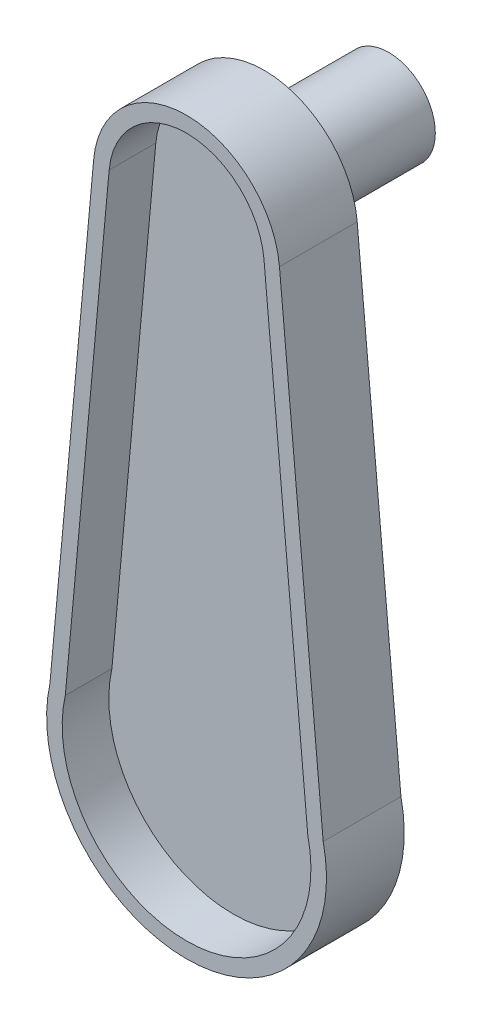
ISO-10303-21;
HEADER;
FILE_DESCRIPTION(('STEP AP214'),'2;1');
FILE_NAME('part.step','',(''),(''),'','','');
FILE_SCHEMA(('AUTOMOTIVE_DESIGN { 1 0 10303 214 1 1 1 1 }'));
ENDSEC;
DATA;
#1=APPLICATION_CONTEXT('core data for automotive mechanical design processes');
#2=APPLICATION_PROTOCOL_DEFINITION('international standard','automotive_design',2000,#1);
#3=PRODUCT_CONTEXT('',#1,'mechanical');
#4=PRODUCT('Part','Part','',(#3));
#5=PRODUCT_RELATED_PRODUCT_CATEGORY('part','',(#4));
#6=PRODUCT_DEFINITION_FORMATION('','',#4);
#7=PRODUCT_DEFINITION_CONTEXT('part definition',#1,'design');
#8=PRODUCT_DEFINITION('design','',#6,#7);
#9=PRODUCT_DEFINITION_SHAPE('','',#8);
#10=(LENGTH_UNIT() NAMED_UNIT(*) SI_UNIT(.MILLI.,.METRE.));
#11=(NAMED_UNIT(*) PLANE_ANGLE_UNIT() SI_UNIT($,.RADIAN.));
#12=(NAMED_UNIT(*) SI_UNIT($,.STERADIAN.) SOLID_ANGLE_UNIT());
#13=UNCERTAINTY_MEASURE_WITH_UNIT(LENGTH_MEASURE(1.E-05),#10,'distance_accuracy_value','');
#14=(GEOMETRIC_REPRESENTATION_CONTEXT(3) GLOBAL_UNCERTAINTY_ASSIGNED_CONTEXT((#13)) GLOBAL_UNIT_ASSIGNED_CONTEXT((#10,
#11,#12)) REPRESENTATION_CONTEXT('',''));
#15=CARTESIAN_POINT('',(0.,0.,0.));
#16=DIRECTION('',(0.,0.,1.));
#17=DIRECTION('',(1.,0.,0.));
#18=AXIS2_PLACEMENT_3D('',#15,#16,#17);
#19=CARTESIAN_POINT('',(0.,0.,1.));
#20=DIRECTION('',(0.,0.,1.));
#21=DIRECTION('',(1.,0.,0.));
#22=AXIS2_PLACEMENT_3D('',#19,#20,#21);
#23=PLANE('',#22);
#24=CARTESIAN_POINT('',(0.,0.,1.));
#25=DIRECTION('',(0.,0.,1.));
#26=DIRECTION('',(1.,0.,0.));
#27=AXIS2_PLACEMENT_3D('',#24,#25,#26);
#28=CIRCLE('',#27,4.);
#29=CARTESIAN_POINT('',(-3.9,0.88881944173156,1.));
#30=VERTEX_POINT('',#29);
#31=CARTESIAN_POINT('',(3.9,0.88881944173156,1.));
#32=VERTEX_POINT('',#31);
#33=EDGE_CURVE('E211',#30,#32,#28,.T.);
#34=ORIENTED_EDGE('',*,*,#33,.T.);
#35=DIRECTION('',(-0.0915624950186931,0.99579933194693,0.));
#36=VECTOR('',#35,1.);
#37=CARTESIAN_POINT('',(3.9,0.88881944173156,1.));
#38=LINE('',#37,#36);
#39=CARTESIAN_POINT('',(2.48949832986733,16.2289062375467,1.));
#40=VERTEX_POINT('',#39);
#41=EDGE_CURVE('E83',#32,#40,#38,.T.);
#42=ORIENTED_EDGE('',*,*,#41,.T.);
#43=CARTESIAN_POINT('',(0.,16.,1.));
#44=DIRECTION('',(0.,0.,-1.));
#45=DIRECTION('',(-1.,0.,0.));
#46=AXIS2_PLACEMENT_3D('',#43,#44,#45);
#47=CIRCLE('',#46,2.5);
#48=CARTESIAN_POINT('',(-2.48949832986733,16.2289062375467,1.));
#49=VERTEX_POINT('',#48);
#50=EDGE_CURVE('E216',#49,#40,#47,.T.);
#51=ORIENTED_EDGE('',*,*,#50,.F.);
#52=DIRECTION('',(0.0915624950186931,0.99579933194693,0.));
#53=VECTOR('',#52,1.);
#54=CARTESIAN_POINT('',(-3.9,0.88881944173156,1.));
#55=LINE('',#54,#53);
#56=EDGE_CURVE('E72',#30,#49,#55,.T.);
#57=ORIENTED_EDGE('',*,*,#56,.F.);
#58=EDGE_LOOP('',(#34,#42,#51,#57));
#59=FACE_BOUND('',#58,.T.);
#60=ADVANCED_FACE('F63',(#59),#23,.T.);
#61=CARTESIAN_POINT('',(0.,0.,2.5));
#62=DIRECTION('',(0.,0.,1.));
#63=DIRECTION('',(1.,0.,0.));
#64=AXIS2_PLACEMENT_3D('',#61,#62,#63);
#65=PLANE('',#64);
#66=CARTESIAN_POINT('',(0.,0.,2.5));
#67=DIRECTION('',(0.,0.,1.));
#68=DIRECTION('',(1.,0.,0.));
#69=AXIS2_PLACEMENT_3D('',#66,#67,#68);
#70=CIRCLE('',#69,4.5);
#71=CARTESIAN_POINT('',(-4.39495457775272,0.966630363422897,2.5));
#72=VERTEX_POINT('',#71);
#73=CARTESIAN_POINT('',(4.39495457775272,0.966630363422897,2.5));
#74=VERTEX_POINT('',#73);
#75=EDGE_CURVE('E170',#72,#74,#70,.T.);
#76=ORIENTED_EDGE('',*,*,#75,.T.);
#77=DIRECTION('',(-0.0915624950186931,0.99579933194693,0.));
#78=VECTOR('',#77,1.);
#79=CARTESIAN_POINT('',(4.39789966597346,0.934600689240907,2.5));
#80=LINE('',#79,#78);
#81=CARTESIAN_POINT('',(2.98739799584079,16.2746874850561,2.5));
#82=VERTEX_POINT('',#81);
#83=EDGE_CURVE('E174',#74,#82,#80,.T.);
#84=ORIENTED_EDGE('',*,*,#83,.T.);
#85=CARTESIAN_POINT('',(0.,16.,2.5));
#86=DIRECTION('',(0.,0.,1.));
#87=DIRECTION('',(1.,0.,0.));
#88=AXIS2_PLACEMENT_3D('',#85,#86,#87);
#89=CIRCLE('',#88,3.);
#90=CARTESIAN_POINT('',(-2.98739799584079,16.2746874850561,2.5));
#91=VERTEX_POINT('',#90);
#92=EDGE_CURVE('E178',#82,#91,#89,.T.);
#93=ORIENTED_EDGE('',*,*,#92,.T.);
#94=DIRECTION('',(-0.0915624950186931,-0.99579933194693,0.));
#95=VECTOR('',#94,1.);
#96=CARTESIAN_POINT('',(-4.39789966597346,0.934600689240907,2.5));
#97=LINE('',#96,#95);
#98=EDGE_CURVE('E181',#91,#72,#97,.T.);
#99=ORIENTED_EDGE('',*,*,#98,.T.);
#100=EDGE_LOOP('',(#76,#84,#93,#99));
#101=FACE_BOUND('',#100,.T.);
#102=DIRECTION('',(-0.0915624950186931,0.99579933194693,0.));
#103=VECTOR('',#102,1.);
#104=CARTESIAN_POINT('',(3.9,0.88881944173156,2.5));
#105=LINE('',#104,#103);
#106=CARTESIAN_POINT('',(3.9,0.88881944173156,2.5));
#107=VERTEX_POINT('',#106);
#108=CARTESIAN_POINT('',(2.48949832986733,16.2289062375467,2.5));
#109=VERTEX_POINT('',#108);
#110=EDGE_CURVE('E138',#107,#109,#105,.T.);
#111=ORIENTED_EDGE('',*,*,#110,.F.);
#112=CARTESIAN_POINT('',(0.,0.,2.5));
#113=DIRECTION('',(0.,0.,1.));
#114=DIRECTION('',(1.,0.,0.));
#115=AXIS2_PLACEMENT_3D('',#112,#113,#114);
#116=CIRCLE('',#115,4.);
#117=CARTESIAN_POINT('',(-3.9,0.88881944173156,2.5));
#118=VERTEX_POINT('',#117);
#119=EDGE_CURVE('E128',#118,#107,#116,.T.);
#120=ORIENTED_EDGE('',*,*,#119,.F.);
#121=DIRECTION('',(-0.0915624950186931,-0.99579933194693,0.));
#122=VECTOR('',#121,1.);
#123=CARTESIAN_POINT('',(-3.9,0.88881944173156,2.5));
#124=LINE('',#123,#122);
#125=CARTESIAN_POINT('',(-2.48949832986733,16.2289062375467,2.5));
#126=VERTEX_POINT('',#125);
#127=EDGE_CURVE('E156',#126,#118,#124,.T.);
#128=ORIENTED_EDGE('',*,*,#127,.F.);
#129=CARTESIAN_POINT('',(0.,16.,2.5));
#130=DIRECTION('',(0.,0.,1.));
#131=DIRECTION('',(-1.,0.,0.));
#132=AXIS2_PLACEMENT_3D('',#129,#130,#131);
#133=CIRCLE('',#132,2.5);
#134=EDGE_CURVE('E152',#109,#126,#133,.T.);
#135=ORIENTED_EDGE('',*,*,#134,.F.);
#136=EDGE_LOOP('',(#111,#120,#128,#135));
#137=FACE_BOUND('',#136,.T.);
#138=ADVANCED_FACE('F150',(#101,#137),#65,.T.);
#139=CARTESIAN_POINT('',(0.,0.,2.5));
#140=DIRECTION('',(0.,0.,-1.));
#141=DIRECTION('',(-1.,0.,0.));
#142=AXIS2_PLACEMENT_3D('',#139,#140,#141);
#143=CYLINDRICAL_SURFACE('',#142,4.5);
#144=CARTESIAN_POINT('',(0.,0.,0.));
#145=DIRECTION('',(0.,0.,1.));
#146=DIRECTION('',(1.,0.,0.));
#147=AXIS2_PLACEMENT_3D('',#144,#145,#146);
#148=CIRCLE('',#147,4.5);
#149=CARTESIAN_POINT('',(-4.39495457775272,0.966630363422897,0.));
#150=VERTEX_POINT('',#149);
#151=CARTESIAN_POINT('',(4.39495457775272,0.966630363422897,0.));
#152=VERTEX_POINT('',#151);
#153=EDGE_CURVE('E146',#150,#152,#148,.T.);
#154=ORIENTED_EDGE('',*,*,#153,.T.);
#155=DIRECTION('',(0.,0.,-1.));
#156=VECTOR('',#155,1.);
#157=CARTESIAN_POINT('',(4.39495457775272,0.966630363422897,2.5));
#158=LINE('',#157,#156);
#159=EDGE_CURVE('E207',#74,#152,#158,.T.);
#160=ORIENTED_EDGE('',*,*,#159,.F.);
#161=ORIENTED_EDGE('',*,*,#75,.F.);
#162=DIRECTION('',(0.,0.,-1.));
#163=VECTOR('',#162,1.);
#164=CARTESIAN_POINT('',(-4.39495457775272,0.966630363422897,2.5));
#165=LINE('',#164,#163);
#166=EDGE_CURVE('E184',#72,#150,#165,.T.);
#167=ORIENTED_EDGE('',*,*,#166,.T.);
#168=EDGE_LOOP('',(#154,#160,#161,#167));
#169=FACE_BOUND('',#168,.T.);
#170=ADVANCED_FACE('F227',(#169),#143,.T.);
#171=CARTESIAN_POINT('',(4.39789966597346,0.934600689240907,2.5));
#172=DIRECTION('',(-0.99579933194693,-0.0915624950186931,0.));
#173=DIRECTION('',(0.0915624950186931,-0.99579933194693,0.));
#174=AXIS2_PLACEMENT_3D('',#171,#172,#173);
#175=PLANE('',#174);
#176=DIRECTION('',(-0.0915624950186931,0.99579933194693,0.));
#177=VECTOR('',#176,1.);
#178=CARTESIAN_POINT('',(4.39789966597346,0.934600689240907,0.));
#179=LINE('',#178,#177);
#180=CARTESIAN_POINT('',(2.98739799584079,16.2746874850561,0.));
#181=VERTEX_POINT('',#180);
#182=EDGE_CURVE('E188',#152,#181,#179,.T.);
#183=ORIENTED_EDGE('',*,*,#182,.T.);
#184=DIRECTION('',(0.,0.,-1.));
#185=VECTOR('',#184,1.);
#186=CARTESIAN_POINT('',(2.98739799584079,16.2746874850561,2.5));
#187=LINE('',#186,#185);
#188=EDGE_CURVE('E203',#82,#181,#187,.T.);
#189=ORIENTED_EDGE('',*,*,#188,.F.);
#190=ORIENTED_EDGE('',*,*,#83,.F.);
#191=ORIENTED_EDGE('',*,*,#159,.T.);
#192=EDGE_LOOP('',(#183,#189,#190,#191));
#193=FACE_BOUND('',#192,.T.);
#194=ADVANCED_FACE('F233',(#193),#175,.F.);
#195=CARTESIAN_POINT('',(0.,16.,2.5));
#196=DIRECTION('',(0.,0.,-1.));
#197=DIRECTION('',(-1.,0.,0.));
#198=AXIS2_PLACEMENT_3D('',#195,#196,#197);
#199=CYLINDRICAL_SURFACE('',#198,3.);
#200=CARTESIAN_POINT('',(0.,16.,0.));
#201=DIRECTION('',(0.,0.,1.));
#202=DIRECTION('',(1.,0.,0.));
#203=AXIS2_PLACEMENT_3D('',#200,#201,#202);
#204=CIRCLE('',#203,3.);
#205=CARTESIAN_POINT('',(-2.98739799584079,16.2746874850561,0.));
#206=VERTEX_POINT('',#205);
#207=EDGE_CURVE('E191',#181,#206,#204,.T.);
#208=ORIENTED_EDGE('',*,*,#207,.T.);
#209=DIRECTION('',(0.,0.,-1.));
#210=VECTOR('',#209,1.);
#211=CARTESIAN_POINT('',(-2.98739799584079,16.2746874850561,2.5));
#212=LINE('',#211,#210);
#213=EDGE_CURVE('E199',#91,#206,#212,.T.);
#214=ORIENTED_EDGE('',*,*,#213,.F.);
#215=ORIENTED_EDGE('',*,*,#92,.F.);
#216=ORIENTED_EDGE('',*,*,#188,.T.);
#217=EDGE_LOOP('',(#208,#214,#215,#216));
#218=FACE_BOUND('',#217,.T.);
#219=ADVANCED_FACE('F237',(#218),#199,.T.);
#220=CARTESIAN_POINT('',(-4.39789966597346,0.934600689240907,2.5));
#221=DIRECTION('',(0.99579933194693,-0.0915624950186931,0.));
#222=DIRECTION('',(0.0915624950186931,0.99579933194693,0.));
#223=AXIS2_PLACEMENT_3D('',#220,#221,#222);
#224=PLANE('',#223);
#225=DIRECTION('',(-0.0915624950186931,-0.99579933194693,0.));
#226=VECTOR('',#225,1.);
#227=CARTESIAN_POINT('',(-4.39789966597346,0.934600689240907,0.));
#228=LINE('',#227,#226);
#229=EDGE_CURVE('E175',#206,#150,#228,.T.);
#230=ORIENTED_EDGE('',*,*,#229,.T.);
#231=ORIENTED_EDGE('',*,*,#166,.F.);
#232=ORIENTED_EDGE('',*,*,#98,.F.);
#233=ORIENTED_EDGE('',*,*,#213,.T.);
#234=EDGE_LOOP('',(#230,#231,#232,#233));
#235=FACE_BOUND('',#234,.T.);
#236=ADVANCED_FACE('F241',(#235),#224,.F.);
#237=CARTESIAN_POINT('',(0.,0.,2.5));
#238=DIRECTION('',(0.,0.,-1.));
#239=DIRECTION('',(-1.,0.,0.));
#240=AXIS2_PLACEMENT_3D('',#237,#238,#239);
#241=CYLINDRICAL_SURFACE('',#240,4.);
#242=DIRECTION('',(0.,0.,-1.));
#243=VECTOR('',#242,1.);
#244=CARTESIAN_POINT('',(3.9,0.88881944173156,2.5));
#245=LINE('',#244,#243);
#246=EDGE_CURVE('E131',#107,#32,#245,.T.);
#247=ORIENTED_EDGE('',*,*,#246,.T.);
#248=ORIENTED_EDGE('',*,*,#33,.F.);
#249=DIRECTION('',(0.,0.,-1.));
#250=VECTOR('',#249,1.);
#251=CARTESIAN_POINT('',(-3.9,0.88881944173156,2.5));
#252=LINE('',#251,#250);
#253=EDGE_CURVE('E133',#118,#30,#252,.T.);
#254=ORIENTED_EDGE('',*,*,#253,.F.);
#255=ORIENTED_EDGE('',*,*,#119,.T.);
#256=EDGE_LOOP('',(#247,#248,#254,#255));
#257=FACE_BOUND('',#256,.T.);
#258=ADVANCED_FACE('F130',(#257),#241,.F.);
#259=CARTESIAN_POINT('',(3.9,0.88881944173156,2.5));
#260=DIRECTION('',(-0.99579933194693,-0.0915624950186931,0.));
#261=DIRECTION('',(0.0915624950186931,-0.99579933194693,0.));
#262=AXIS2_PLACEMENT_3D('',#259,#260,#261);
#263=PLANE('',#262);
#264=DIRECTION('',(0.,0.,-1.));
#265=VECTOR('',#264,1.);
#266=CARTESIAN_POINT('',(2.48949832986733,16.2289062375467,2.5));
#267=LINE('',#266,#265);
#268=EDGE_CURVE('E147',#109,#40,#267,.T.);
#269=ORIENTED_EDGE('',*,*,#268,.T.);
#270=ORIENTED_EDGE('',*,*,#41,.F.);
#271=ORIENTED_EDGE('',*,*,#246,.F.);
#272=ORIENTED_EDGE('',*,*,#110,.T.);
#273=EDGE_LOOP('',(#269,#270,#271,#272));
#274=FACE_BOUND('',#273,.T.);
#275=ADVANCED_FACE('F143',(#274),#263,.T.);
#276=CARTESIAN_POINT('',(0.,16.,2.5));
#277=DIRECTION('',(0.,0.,-1.));
#278=DIRECTION('',(-1.,0.,0.));
#279=AXIS2_PLACEMENT_3D('',#276,#277,#278);
#280=CYLINDRICAL_SURFACE('',#279,2.5);
#281=DIRECTION('',(0.,0.,-1.));
#282=VECTOR('',#281,1.);
#283=CARTESIAN_POINT('',(-2.48949832986733,16.2289062375467,2.5));
#284=LINE('',#283,#282);
#285=EDGE_CURVE('E164',#126,#49,#284,.T.);
#286=ORIENTED_EDGE('',*,*,#285,.T.);
#287=ORIENTED_EDGE('',*,*,#50,.T.);
#288=ORIENTED_EDGE('',*,*,#268,.F.);
#289=ORIENTED_EDGE('',*,*,#134,.T.);
#290=EDGE_LOOP('',(#286,#287,#288,#289));
#291=FACE_BOUND('',#290,.T.);
#292=ADVANCED_FACE('F222',(#291),#280,.F.);
#293=CARTESIAN_POINT('',(-3.9,0.88881944173156,2.5));
#294=DIRECTION('',(0.99579933194693,-0.0915624950186931,0.));
#295=DIRECTION('',(0.0915624950186931,0.99579933194693,0.));
#296=AXIS2_PLACEMENT_3D('',#293,#294,#295);
#297=PLANE('',#296);
#298=ORIENTED_EDGE('',*,*,#253,.T.);
#299=ORIENTED_EDGE('',*,*,#56,.T.);
#300=ORIENTED_EDGE('',*,*,#285,.F.);
#301=ORIENTED_EDGE('',*,*,#127,.T.);
#302=EDGE_LOOP('',(#298,#299,#300,#301));
#303=FACE_BOUND('',#302,.T.);
#304=ADVANCED_FACE('F220',(#303),#297,.T.);
#305=CARTESIAN_POINT('',(0.,0.,0.));
#306=DIRECTION('',(0.,0.,1.));
#307=DIRECTION('',(1.,0.,0.));
#308=AXIS2_PLACEMENT_3D('',#305,#306,#307);
#309=PLANE('',#308);
#310=CARTESIAN_POINT('',(0.,16.,0.));
#311=DIRECTION('',(0.,0.,1.));
#312=DIRECTION('',(1.,0.,0.));
#313=AXIS2_PLACEMENT_3D('',#310,#311,#312);
#314=CIRCLE('',#313,1.5);
#315=CARTESIAN_POINT('',(1.5,16.,0.));
#316=VERTEX_POINT('',#315);
#317=EDGE_CURVE('E12',#316,#316,#314,.F.);
#318=ORIENTED_EDGE('',*,*,#317,.F.);
#319=EDGE_LOOP('',(#318));
#320=FACE_BOUND('',#319,.T.);
#321=ORIENTED_EDGE('',*,*,#153,.F.);
#322=ORIENTED_EDGE('',*,*,#229,.F.);
#323=ORIENTED_EDGE('',*,*,#207,.F.);
#324=ORIENTED_EDGE('',*,*,#182,.F.);
#325=EDGE_LOOP('',(#321,#322,#323,#324));
#326=FACE_BOUND('',#325,.T.);
#327=ADVANCED_FACE('F65',(#320,#326),#309,.F.);
#328=CARTESIAN_POINT('',(0.,16.,-4.));
#329=DIRECTION('',(0.,0.,1.));
#330=DIRECTION('',(1.,0.,0.));
#331=AXIS2_PLACEMENT_3D('',#328,#329,#330);
#332=CYLINDRICAL_SURFACE('',#331,1.5);
#333=CARTESIAN_POINT('',(0.,16.,-4.));
#334=DIRECTION('',(0.,0.,-1.));
#335=DIRECTION('',(-1.,0.,0.));
#336=AXIS2_PLACEMENT_3D('',#333,#334,#335);
#337=CIRCLE('',#336,1.5);
#338=CARTESIAN_POINT('',(-1.5,16.,-4.));
#339=VERTEX_POINT('',#338);
#340=EDGE_CURVE('E139',#339,#339,#337,.T.);
#341=ORIENTED_EDGE('',*,*,#340,.F.);
#342=EDGE_LOOP('',(#341));
#343=FACE_BOUND('',#342,.T.);
#344=ORIENTED_EDGE('',*,*,#317,.T.);
#345=EDGE_LOOP('',(#344));
#346=FACE_BOUND('',#345,.T.);
#347=ADVANCED_FACE('F254',(#343,#346),#332,.T.);
#348=CARTESIAN_POINT('',(0.,16.,-4.));
#349=DIRECTION('',(0.,0.,-1.));
#350=DIRECTION('',(-1.,0.,0.));
#351=AXIS2_PLACEMENT_3D('',#348,#349,#350);
#352=PLANE('',#351);
#353=ORIENTED_EDGE('',*,*,#340,.T.);
#354=EDGE_LOOP('',(#353));
#355=FACE_BOUND('',#354,.T.);
#356=ADVANCED_FACE('F257',(#355),#352,.T.);
#357=CLOSED_SHELL('',(#60,#138,#170,#194,#219,#236,#258,#275,#292,#304,#327,#347,#356));
#358=MANIFOLD_SOLID_BREP('B2',#357);
#359=ADVANCED_BREP_SHAPE_REPRESENTATION('',(#18,#358),#14);
#360=SHAPE_DEFINITION_REPRESENTATION(#9,#359);
ENDSEC;
END-ISO-10303-21;
